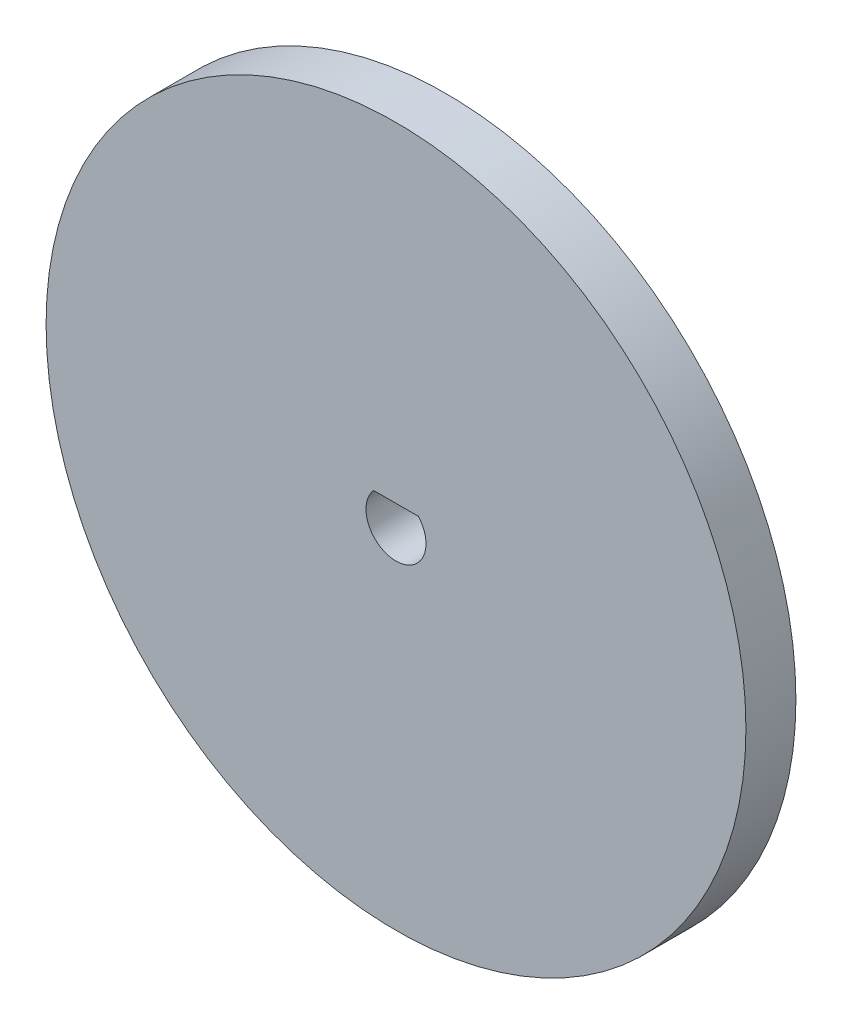
ISO-10303-21;
HEADER;
FILE_DESCRIPTION(('STEP AP214'),'2;1');
FILE_NAME('part.step','',(''),(''),'','','');
FILE_SCHEMA(('AUTOMOTIVE_DESIGN { 1 0 10303 214 1 1 1 1 }'));
ENDSEC;
DATA;
#1=APPLICATION_CONTEXT('core data for automotive mechanical design processes');
#2=APPLICATION_PROTOCOL_DEFINITION('international standard','automotive_design',2000,#1);
#3=PRODUCT_CONTEXT('',#1,'mechanical');
#4=PRODUCT('Part','Part','',(#3));
#5=PRODUCT_RELATED_PRODUCT_CATEGORY('part','',(#4));
#6=PRODUCT_DEFINITION_FORMATION('','',#4);
#7=PRODUCT_DEFINITION_CONTEXT('part definition',#1,'design');
#8=PRODUCT_DEFINITION('design','',#6,#7);
#9=PRODUCT_DEFINITION_SHAPE('','',#8);
#10=(LENGTH_UNIT() NAMED_UNIT(*) SI_UNIT(.MILLI.,.METRE.));
#11=(NAMED_UNIT(*) PLANE_ANGLE_UNIT() SI_UNIT($,.RADIAN.));
#12=(NAMED_UNIT(*) SI_UNIT($,.STERADIAN.) SOLID_ANGLE_UNIT());
#13=UNCERTAINTY_MEASURE_WITH_UNIT(LENGTH_MEASURE(1.E-05),#10,'distance_accuracy_value','');
#14=(GEOMETRIC_REPRESENTATION_CONTEXT(3) GLOBAL_UNCERTAINTY_ASSIGNED_CONTEXT((#13)) GLOBAL_UNIT_ASSIGNED_CONTEXT((#10,
#11,#12)) REPRESENTATION_CONTEXT('',''));
#15=CARTESIAN_POINT('',(0.,0.,0.));
#16=DIRECTION('',(0.,0.,1.));
#17=DIRECTION('',(1.,0.,0.));
#18=AXIS2_PLACEMENT_3D('',#15,#16,#17);
#19=CARTESIAN_POINT('',(0.,0.,2.5));
#20=DIRECTION('',(0.,0.,1.));
#21=DIRECTION('',(1.,0.,0.));
#22=AXIS2_PLACEMENT_3D('',#19,#20,#21);
#23=PLANE('',#22);
#24=CARTESIAN_POINT('',(0.,0.,2.5));
#25=DIRECTION('',(0.,0.,1.));
#26=DIRECTION('',(1.,0.,0.));
#27=AXIS2_PLACEMENT_3D('',#24,#25,#26);
#28=CIRCLE('',#27,17.5);
#29=CARTESIAN_POINT('',(17.5,0.,2.5));
#30=VERTEX_POINT('',#29);
#31=EDGE_CURVE('E11',#30,#30,#28,.T.);
#32=ORIENTED_EDGE('',*,*,#31,.T.);
#33=EDGE_LOOP('',(#32));
#34=FACE_BOUND('',#33,.T.);
#35=DIRECTION('',(-1.,0.,0.));
#36=VECTOR('',#35,1.);
#37=CARTESIAN_POINT('',(-1.12,0.997797574661314,2.5));
#38=LINE('',#37,#36);
#39=CARTESIAN_POINT('',(1.12,0.997797574661314,2.5));
#40=VERTEX_POINT('',#39);
#41=CARTESIAN_POINT('',(-1.12,0.997797574661314,2.5));
#42=VERTEX_POINT('',#41);
#43=EDGE_CURVE('E84',#40,#42,#38,.T.);
#44=ORIENTED_EDGE('',*,*,#43,.F.);
#45=CARTESIAN_POINT('',(0.,0.,2.5));
#46=DIRECTION('',(0.,0.,1.));
#47=DIRECTION('',(1.,0.,0.));
#48=AXIS2_PLACEMENT_3D('',#45,#46,#47);
#49=CIRCLE('',#48,1.5);
#50=EDGE_CURVE('E73',#42,#40,#49,.T.);
#51=ORIENTED_EDGE('',*,*,#50,.F.);
#52=EDGE_LOOP('',(#44,#51));
#53=FACE_BOUND('',#52,.T.);
#54=ADVANCED_FACE('F39',(#34,#53),#23,.T.);
#55=CARTESIAN_POINT('',(0.,0.,0.));
#56=DIRECTION('',(0.,0.,1.));
#57=DIRECTION('',(1.,0.,0.));
#58=AXIS2_PLACEMENT_3D('',#55,#56,#57);
#59=PLANE('',#58);
#60=CARTESIAN_POINT('',(0.,0.,0.));
#61=DIRECTION('',(0.,0.,1.));
#62=DIRECTION('',(1.,0.,0.));
#63=AXIS2_PLACEMENT_3D('',#60,#61,#62);
#64=CIRCLE('',#63,17.5);
#65=CARTESIAN_POINT('',(17.5,0.,0.));
#66=VERTEX_POINT('',#65);
#67=EDGE_CURVE('E43',#66,#66,#64,.T.);
#68=ORIENTED_EDGE('',*,*,#67,.F.);
#69=EDGE_LOOP('',(#68));
#70=FACE_BOUND('',#69,.T.);
#71=CARTESIAN_POINT('',(0.,0.,0.));
#72=DIRECTION('',(0.,0.,1.));
#73=DIRECTION('',(1.,0.,0.));
#74=AXIS2_PLACEMENT_3D('',#71,#72,#73);
#75=CIRCLE('',#74,1.5);
#76=CARTESIAN_POINT('',(-1.12,0.997797574661314,0.));
#77=VERTEX_POINT('',#76);
#78=CARTESIAN_POINT('',(1.12,0.997797574661314,0.));
#79=VERTEX_POINT('',#78);
#80=EDGE_CURVE('E62',#77,#79,#75,.T.);
#81=ORIENTED_EDGE('',*,*,#80,.T.);
#82=DIRECTION('',(-1.,0.,0.));
#83=VECTOR('',#82,1.);
#84=CARTESIAN_POINT('',(-1.12,0.997797574661314,0.));
#85=LINE('',#84,#83);
#86=EDGE_CURVE('E68',#79,#77,#85,.T.);
#87=ORIENTED_EDGE('',*,*,#86,.T.);
#88=EDGE_LOOP('',(#81,#87));
#89=FACE_BOUND('',#88,.T.);
#90=ADVANCED_FACE('F80',(#70,#89),#59,.F.);
#91=CARTESIAN_POINT('',(0.,0.,2.5));
#92=DIRECTION('',(0.,0.,-1.));
#93=DIRECTION('',(-1.,0.,0.));
#94=AXIS2_PLACEMENT_3D('',#91,#92,#93);
#95=CYLINDRICAL_SURFACE('',#94,17.5);
#96=ORIENTED_EDGE('',*,*,#31,.F.);
#97=EDGE_LOOP('',(#96));
#98=FACE_BOUND('',#97,.T.);
#99=ORIENTED_EDGE('',*,*,#67,.T.);
#100=EDGE_LOOP('',(#99));
#101=FACE_BOUND('',#100,.T.);
#102=ADVANCED_FACE('F41',(#98,#101),#95,.T.);
#103=CARTESIAN_POINT('',(0.,0.,2.5));
#104=DIRECTION('',(0.,0.,-1.));
#105=DIRECTION('',(-1.,0.,0.));
#106=AXIS2_PLACEMENT_3D('',#103,#104,#105);
#107=CYLINDRICAL_SURFACE('',#106,1.5);
#108=ORIENTED_EDGE('',*,*,#80,.F.);
#109=DIRECTION('',(0.,0.,-1.));
#110=VECTOR('',#109,1.);
#111=CARTESIAN_POINT('',(-1.12,0.997797574661314,2.5));
#112=LINE('',#111,#110);
#113=EDGE_CURVE('E70',#42,#77,#112,.T.);
#114=ORIENTED_EDGE('',*,*,#113,.F.);
#115=ORIENTED_EDGE('',*,*,#50,.T.);
#116=DIRECTION('',(0.,0.,-1.));
#117=VECTOR('',#116,1.);
#118=CARTESIAN_POINT('',(1.12,0.997797574661314,2.5));
#119=LINE('',#118,#117);
#120=EDGE_CURVE('E55',#40,#79,#119,.T.);
#121=ORIENTED_EDGE('',*,*,#120,.T.);
#122=EDGE_LOOP('',(#108,#114,#115,#121));
#123=FACE_BOUND('',#122,.T.);
#124=ADVANCED_FACE('F75',(#123),#107,.F.);
#125=CARTESIAN_POINT('',(-1.12,0.997797574661314,2.5));
#126=DIRECTION('',(0.,-1.,0.));
#127=DIRECTION('',(0.,0.,-1.));
#128=AXIS2_PLACEMENT_3D('',#125,#126,#127);
#129=PLANE('',#128);
#130=ORIENTED_EDGE('',*,*,#86,.F.);
#131=ORIENTED_EDGE('',*,*,#120,.F.);
#132=ORIENTED_EDGE('',*,*,#43,.T.);
#133=ORIENTED_EDGE('',*,*,#113,.T.);
#134=EDGE_LOOP('',(#130,#131,#132,#133));
#135=FACE_BOUND('',#134,.T.);
#136=ADVANCED_FACE('F69',(#135),#129,.T.);
#137=CLOSED_SHELL('',(#54,#90,#102,#124,#136));
#138=MANIFOLD_SOLID_BREP('B2',#137);
#139=ADVANCED_BREP_SHAPE_REPRESENTATION('',(#18,#138),#14);
#140=SHAPE_DEFINITION_REPRESENTATION(#9,#139);
ENDSEC;
END-ISO-10303-21;
